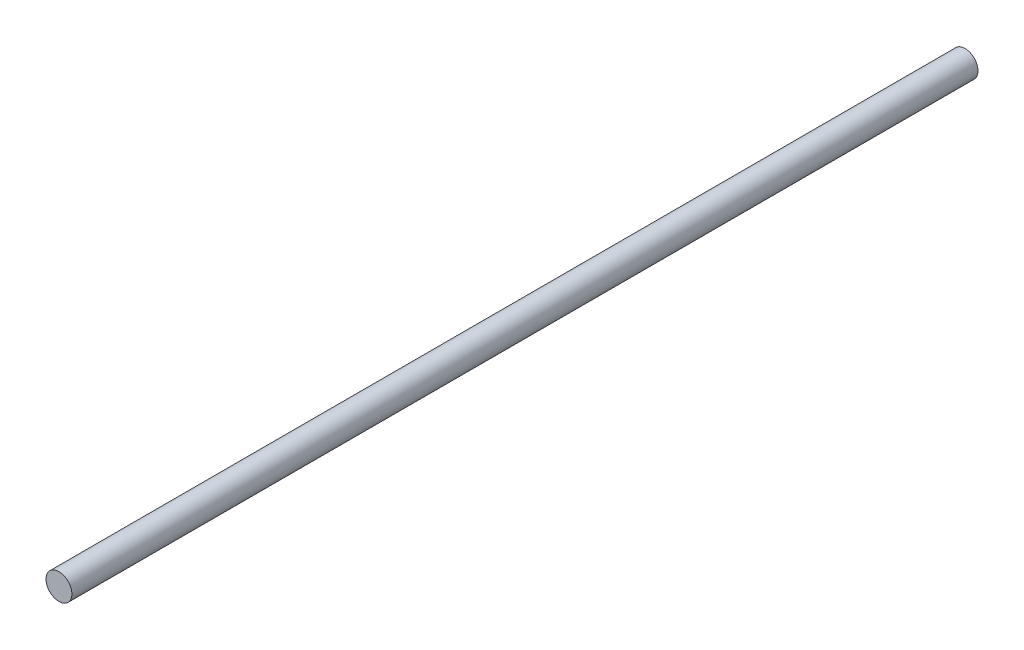
ISO-10303-21;
HEADER;
FILE_DESCRIPTION(('STEP AP214'),'2;1');
FILE_NAME('part.step','',(''),(''),'','','');
FILE_SCHEMA(('AUTOMOTIVE_DESIGN { 1 0 10303 214 1 1 1 1 }'));
ENDSEC;
DATA;
#1=APPLICATION_CONTEXT('core data for automotive mechanical design processes');
#2=APPLICATION_PROTOCOL_DEFINITION('international standard','automotive_design',2000,#1);
#3=PRODUCT_CONTEXT('',#1,'mechanical');
#4=PRODUCT('Part','Part','',(#3));
#5=PRODUCT_RELATED_PRODUCT_CATEGORY('part','',(#4));
#6=PRODUCT_DEFINITION_FORMATION('','',#4);
#7=PRODUCT_DEFINITION_CONTEXT('part definition',#1,'design');
#8=PRODUCT_DEFINITION('design','',#6,#7);
#9=PRODUCT_DEFINITION_SHAPE('','',#8);
#10=(LENGTH_UNIT() NAMED_UNIT(*) SI_UNIT(.MILLI.,.METRE.));
#11=(NAMED_UNIT(*) PLANE_ANGLE_UNIT() SI_UNIT($,.RADIAN.));
#12=(NAMED_UNIT(*) SI_UNIT($,.STERADIAN.) SOLID_ANGLE_UNIT());
#13=UNCERTAINTY_MEASURE_WITH_UNIT(LENGTH_MEASURE(1.E-05),#10,'distance_accuracy_value','');
#14=(GEOMETRIC_REPRESENTATION_CONTEXT(3) GLOBAL_UNCERTAINTY_ASSIGNED_CONTEXT((#13)) GLOBAL_UNIT_ASSIGNED_CONTEXT((#10,
#11,#12)) REPRESENTATION_CONTEXT('',''));
#15=CARTESIAN_POINT('',(0.,0.,0.));
#16=DIRECTION('',(0.,0.,1.));
#17=DIRECTION('',(1.,0.,0.));
#18=AXIS2_PLACEMENT_3D('',#15,#16,#17);
#19=CARTESIAN_POINT('',(0.,0.,444.5));
#20=DIRECTION('',(0.,0.,-1.));
#21=DIRECTION('',(-1.,0.,0.));
#22=AXIS2_PLACEMENT_3D('',#19,#20,#21);
#23=CYLINDRICAL_SURFACE('',#22,6.35);
#24=CARTESIAN_POINT('',(0.,0.,444.5));
#25=DIRECTION('',(0.,0.,1.));
#26=DIRECTION('',(1.,0.,0.));
#27=AXIS2_PLACEMENT_3D('',#24,#25,#26);
#28=CIRCLE('',#27,6.35);
#29=CARTESIAN_POINT('',(6.35,0.,444.5));
#30=VERTEX_POINT('',#29);
#31=EDGE_CURVE('E10',#30,#30,#28,.T.);
#32=ORIENTED_EDGE('',*,*,#31,.F.);
#33=EDGE_LOOP('',(#32));
#34=FACE_BOUND('',#33,.T.);
#35=CARTESIAN_POINT('',(0.,0.,0.));
#36=DIRECTION('',(0.,0.,1.));
#37=DIRECTION('',(1.,0.,0.));
#38=AXIS2_PLACEMENT_3D('',#35,#36,#37);
#39=CIRCLE('',#38,6.35);
#40=CARTESIAN_POINT('',(6.35,0.,0.));
#41=VERTEX_POINT('',#40);
#42=EDGE_CURVE('E37',#41,#41,#39,.T.);
#43=ORIENTED_EDGE('',*,*,#42,.T.);
#44=EDGE_LOOP('',(#43));
#45=FACE_BOUND('',#44,.T.);
#46=ADVANCED_FACE('F34',(#34,#45),#23,.T.);
#47=CARTESIAN_POINT('',(0.,0.,444.5));
#48=DIRECTION('',(0.,0.,1.));
#49=DIRECTION('',(1.,0.,0.));
#50=AXIS2_PLACEMENT_3D('',#47,#48,#49);
#51=PLANE('',#50);
#52=ORIENTED_EDGE('',*,*,#31,.T.);
#53=EDGE_LOOP('',(#52));
#54=FACE_BOUND('',#53,.T.);
#55=ADVANCED_FACE('F49',(#54),#51,.T.);
#56=CARTESIAN_POINT('',(0.,0.,0.));
#57=DIRECTION('',(0.,0.,1.));
#58=DIRECTION('',(1.,0.,0.));
#59=AXIS2_PLACEMENT_3D('',#56,#57,#58);
#60=PLANE('',#59);
#61=ORIENTED_EDGE('',*,*,#42,.F.);
#62=EDGE_LOOP('',(#61));
#63=FACE_BOUND('',#62,.T.);
#64=ADVANCED_FACE('F47',(#63),#60,.F.);
#65=CLOSED_SHELL('',(#46,#55,#64));
#66=MANIFOLD_SOLID_BREP('B2',#65);
#67=ADVANCED_BREP_SHAPE_REPRESENTATION('',(#18,#66),#14);
#68=SHAPE_DEFINITION_REPRESENTATION(#9,#67);
ENDSEC;
END-ISO-10303-21;
